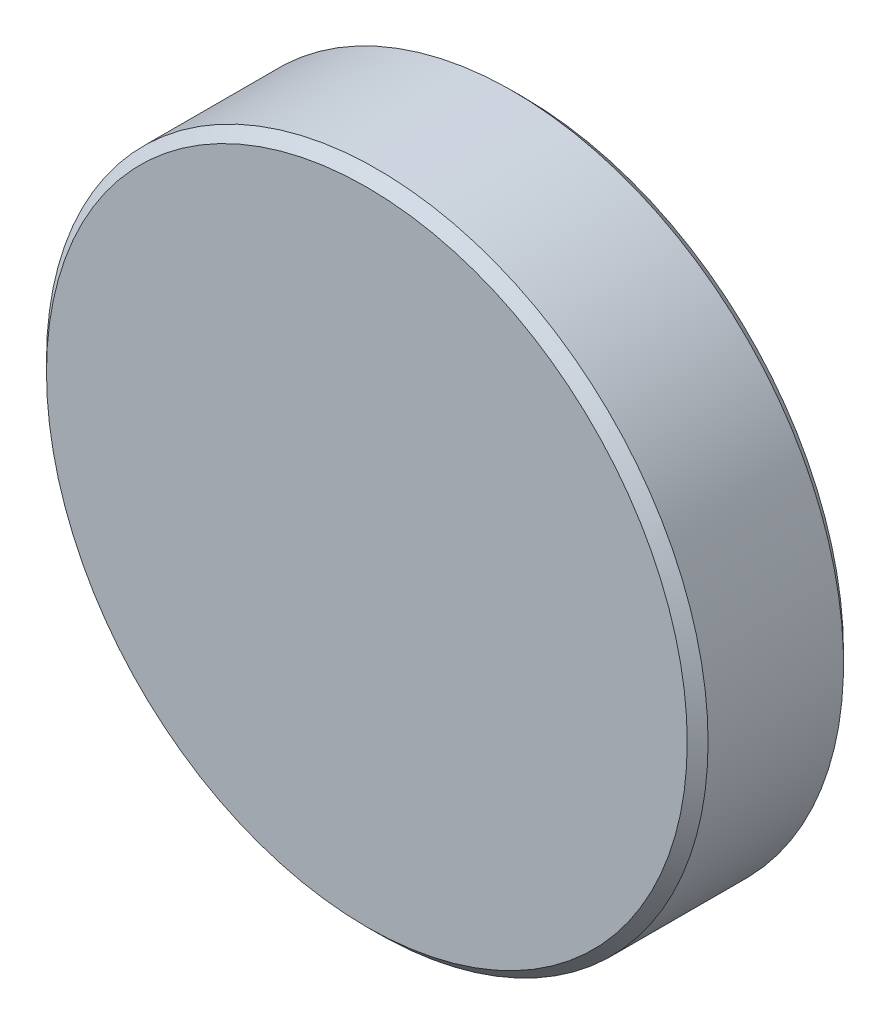
ISO-10303-21;
HEADER;
FILE_DESCRIPTION(('STEP AP214'),'2;1');
FILE_NAME('part.step','',(''),(''),'','','');
FILE_SCHEMA(('AUTOMOTIVE_DESIGN { 1 0 10303 214 1 1 1 1 }'));
ENDSEC;
DATA;
#1=APPLICATION_CONTEXT('core data for automotive mechanical design processes');
#2=APPLICATION_PROTOCOL_DEFINITION('international standard','automotive_design',2000,#1);
#3=PRODUCT_CONTEXT('',#1,'mechanical');
#4=PRODUCT('Part','Part','',(#3));
#5=PRODUCT_RELATED_PRODUCT_CATEGORY('part','',(#4));
#6=PRODUCT_DEFINITION_FORMATION('','',#4);
#7=PRODUCT_DEFINITION_CONTEXT('part definition',#1,'design');
#8=PRODUCT_DEFINITION('design','',#6,#7);
#9=PRODUCT_DEFINITION_SHAPE('','',#8);
#10=(LENGTH_UNIT() NAMED_UNIT(*) SI_UNIT(.MILLI.,.METRE.));
#11=(NAMED_UNIT(*) PLANE_ANGLE_UNIT() SI_UNIT($,.RADIAN.));
#12=(NAMED_UNIT(*) SI_UNIT($,.STERADIAN.) SOLID_ANGLE_UNIT());
#13=UNCERTAINTY_MEASURE_WITH_UNIT(LENGTH_MEASURE(1.E-05),#10,'distance_accuracy_value','');
#14=(GEOMETRIC_REPRESENTATION_CONTEXT(3) GLOBAL_UNCERTAINTY_ASSIGNED_CONTEXT((#13)) GLOBAL_UNIT_ASSIGNED_CONTEXT((#10,
#11,#12)) REPRESENTATION_CONTEXT('',''));
#15=CARTESIAN_POINT('',(0.,0.,0.));
#16=DIRECTION('',(0.,0.,1.));
#17=DIRECTION('',(1.,0.,0.));
#18=AXIS2_PLACEMENT_3D('',#15,#16,#17);
#19=CARTESIAN_POINT('',(0.,0.,2.));
#20=DIRECTION('',(0.,0.,-1.));
#21=DIRECTION('',(-1.,0.,0.));
#22=AXIS2_PLACEMENT_3D('',#19,#20,#21);
#23=PLANE('',#22);
#24=CARTESIAN_POINT('',(0.,0.,2.));
#25=DIRECTION('',(0.,0.,-1.));
#26=DIRECTION('',(-1.,0.,0.));
#27=AXIS2_PLACEMENT_3D('',#24,#25,#26);
#28=CIRCLE('',#27,6.15);
#29=CARTESIAN_POINT('',(-6.15,0.,2.));
#30=VERTEX_POINT('',#29);
#31=EDGE_CURVE('E10',#30,#30,#28,.T.);
#32=ORIENTED_EDGE('',*,*,#31,.T.);
#33=EDGE_LOOP('',(#32));
#34=FACE_BOUND('',#33,.T.);
#35=ADVANCED_FACE('F40',(#34),#23,.T.);
#36=CARTESIAN_POINT('',(0.,0.,5.));
#37=DIRECTION('',(0.,0.,-1.));
#38=DIRECTION('',(-1.,0.,0.));
#39=AXIS2_PLACEMENT_3D('',#36,#37,#38);
#40=CYLINDRICAL_SURFACE('',#39,6.35);
#41=CARTESIAN_POINT('',(0.,0.,4.8));
#42=DIRECTION('',(0.,0.,1.));
#43=DIRECTION('',(1.,0.,0.));
#44=AXIS2_PLACEMENT_3D('',#41,#42,#43);
#45=CIRCLE('',#44,6.35);
#46=CARTESIAN_POINT('',(6.35,0.,4.8));
#47=VERTEX_POINT('',#46);
#48=EDGE_CURVE('E52',#47,#47,#45,.F.);
#49=ORIENTED_EDGE('',*,*,#48,.T.);
#50=EDGE_LOOP('',(#49));
#51=FACE_BOUND('',#50,.T.);
#52=CARTESIAN_POINT('',(0.,0.,2.2));
#53=DIRECTION('',(0.,0.,-1.));
#54=DIRECTION('',(-1.,0.,0.));
#55=AXIS2_PLACEMENT_3D('',#52,#53,#54);
#56=CIRCLE('',#55,6.35);
#57=CARTESIAN_POINT('',(-6.35,0.,2.2));
#58=VERTEX_POINT('',#57);
#59=EDGE_CURVE('E56',#58,#58,#56,.F.);
#60=ORIENTED_EDGE('',*,*,#59,.T.);
#61=EDGE_LOOP('',(#60));
#62=FACE_BOUND('',#61,.T.);
#63=ADVANCED_FACE('F62',(#51,#62),#40,.T.);
#64=CARTESIAN_POINT('',(0.,0.,5.));
#65=DIRECTION('',(0.,0.,1.));
#66=DIRECTION('',(1.,0.,0.));
#67=AXIS2_PLACEMENT_3D('',#64,#65,#66);
#68=PLANE('',#67);
#69=CARTESIAN_POINT('',(0.,0.,5.));
#70=DIRECTION('',(0.,0.,1.));
#71=DIRECTION('',(1.,0.,0.));
#72=AXIS2_PLACEMENT_3D('',#69,#70,#71);
#73=CIRCLE('',#72,6.15);
#74=CARTESIAN_POINT('',(6.15,0.,5.));
#75=VERTEX_POINT('',#74);
#76=EDGE_CURVE('E48',#75,#75,#73,.T.);
#77=ORIENTED_EDGE('',*,*,#76,.T.);
#78=EDGE_LOOP('',(#77));
#79=FACE_BOUND('',#78,.T.);
#80=ADVANCED_FACE('F70',(#79),#68,.T.);
#81=CARTESIAN_POINT('',(0.,0.,4.8));
#82=DIRECTION('',(0.,0.,-1.));
#83=DIRECTION('',(-1.,0.,0.));
#84=AXIS2_PLACEMENT_3D('',#81,#82,#83);
#85=CONICAL_SURFACE('',#84,6.35,0.785398163397455);
#86=ORIENTED_EDGE('',*,*,#76,.F.);
#87=EDGE_LOOP('',(#86));
#88=FACE_BOUND('',#87,.T.);
#89=ORIENTED_EDGE('',*,*,#48,.F.);
#90=EDGE_LOOP('',(#89));
#91=FACE_BOUND('',#90,.T.);
#92=ADVANCED_FACE('F66',(#88,#91),#85,.T.);
#93=CARTESIAN_POINT('',(0.,0.,2.));
#94=DIRECTION('',(0.,0.,1.));
#95=DIRECTION('',(1.,0.,0.));
#96=AXIS2_PLACEMENT_3D('',#93,#94,#95);
#97=CONICAL_SURFACE('',#96,6.15,0.785398163397446);
#98=ORIENTED_EDGE('',*,*,#59,.F.);
#99=EDGE_LOOP('',(#98));
#100=FACE_BOUND('',#99,.T.);
#101=ORIENTED_EDGE('',*,*,#31,.F.);
#102=EDGE_LOOP('',(#101));
#103=FACE_BOUND('',#102,.T.);
#104=ADVANCED_FACE('F43',(#100,#103),#97,.T.);
#105=CLOSED_SHELL('',(#35,#63,#80,#92,#104));
#106=MANIFOLD_SOLID_BREP('B2',#105);
#107=ADVANCED_BREP_SHAPE_REPRESENTATION('',(#18,#106),#14);
#108=SHAPE_DEFINITION_REPRESENTATION(#9,#107);
ENDSEC;
END-ISO-10303-21;
